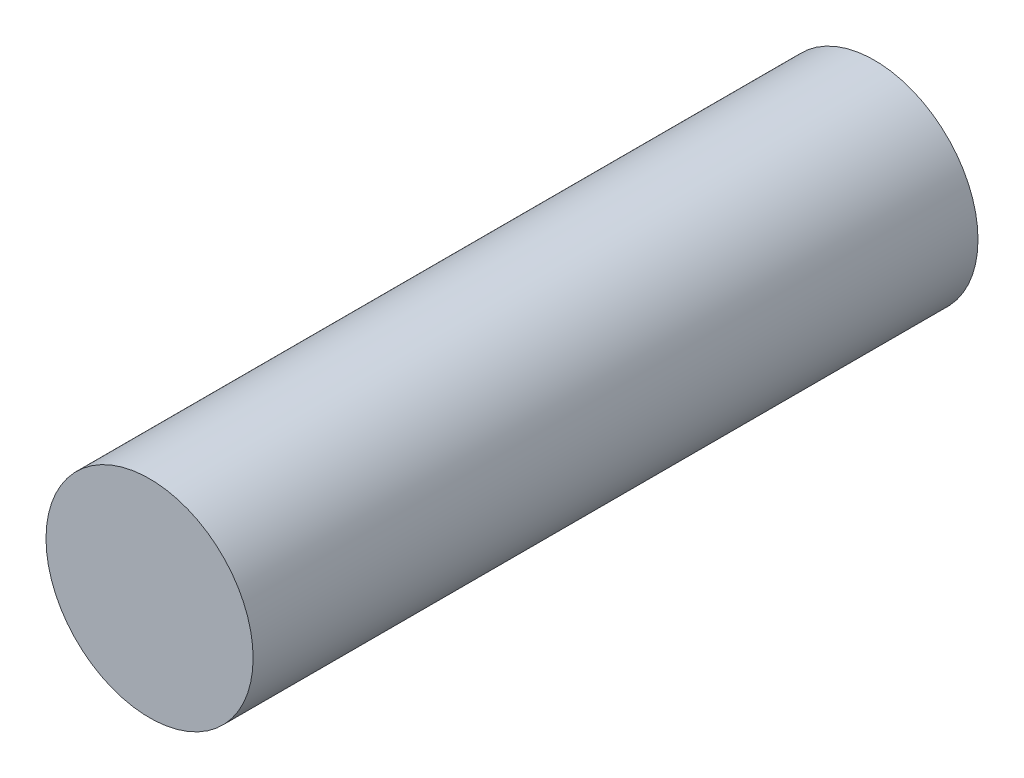
ISO-10303-21;
HEADER;
FILE_DESCRIPTION(('STEP AP214'),'2;1');
FILE_NAME('part.step','',(''),(''),'','','');
FILE_SCHEMA(('AUTOMOTIVE_DESIGN { 1 0 10303 214 1 1 1 1 }'));
ENDSEC;
DATA;
#1=APPLICATION_CONTEXT('core data for automotive mechanical design processes');
#2=APPLICATION_PROTOCOL_DEFINITION('international standard','automotive_design',2000,#1);
#3=PRODUCT_CONTEXT('',#1,'mechanical');
#4=PRODUCT('Part','Part','',(#3));
#5=PRODUCT_RELATED_PRODUCT_CATEGORY('part','',(#4));
#6=PRODUCT_DEFINITION_FORMATION('','',#4);
#7=PRODUCT_DEFINITION_CONTEXT('part definition',#1,'design');
#8=PRODUCT_DEFINITION('design','',#6,#7);
#9=PRODUCT_DEFINITION_SHAPE('','',#8);
#10=(LENGTH_UNIT() NAMED_UNIT(*) SI_UNIT(.MILLI.,.METRE.));
#11=(NAMED_UNIT(*) PLANE_ANGLE_UNIT() SI_UNIT($,.RADIAN.));
#12=(NAMED_UNIT(*) SI_UNIT($,.STERADIAN.) SOLID_ANGLE_UNIT());
#13=UNCERTAINTY_MEASURE_WITH_UNIT(LENGTH_MEASURE(1.E-05),#10,'distance_accuracy_value','');
#14=(GEOMETRIC_REPRESENTATION_CONTEXT(3) GLOBAL_UNCERTAINTY_ASSIGNED_CONTEXT((#13)) GLOBAL_UNIT_ASSIGNED_CONTEXT((#10,
#11,#12)) REPRESENTATION_CONTEXT('',''));
#15=CARTESIAN_POINT('',(0.,0.,0.));
#16=DIRECTION('',(0.,0.,1.));
#17=DIRECTION('',(1.,0.,0.));
#18=AXIS2_PLACEMENT_3D('',#15,#16,#17);
#19=CARTESIAN_POINT('',(0.,0.,88.9));
#20=DIRECTION('',(0.,0.,-1.));
#21=DIRECTION('',(-1.,0.,0.));
#22=AXIS2_PLACEMENT_3D('',#19,#20,#21);
#23=CYLINDRICAL_SURFACE('',#22,12.7);
#24=CARTESIAN_POINT('',(0.,0.,88.9));
#25=DIRECTION('',(0.,0.,1.));
#26=DIRECTION('',(1.,0.,0.));
#27=AXIS2_PLACEMENT_3D('',#24,#25,#26);
#28=CIRCLE('',#27,12.7);
#29=CARTESIAN_POINT('',(12.7,0.,88.9));
#30=VERTEX_POINT('',#29);
#31=EDGE_CURVE('E10',#30,#30,#28,.T.);
#32=ORIENTED_EDGE('',*,*,#31,.F.);
#33=EDGE_LOOP('',(#32));
#34=FACE_BOUND('',#33,.T.);
#35=CARTESIAN_POINT('',(0.,0.,0.));
#36=DIRECTION('',(0.,0.,1.));
#37=DIRECTION('',(1.,0.,0.));
#38=AXIS2_PLACEMENT_3D('',#35,#36,#37);
#39=CIRCLE('',#38,12.7);
#40=CARTESIAN_POINT('',(12.7,0.,0.));
#41=VERTEX_POINT('',#40);
#42=EDGE_CURVE('E40',#41,#41,#39,.T.);
#43=ORIENTED_EDGE('',*,*,#42,.T.);
#44=EDGE_LOOP('',(#43));
#45=FACE_BOUND('',#44,.T.);
#46=ADVANCED_FACE('F37',(#34,#45),#23,.T.);
#47=CARTESIAN_POINT('',(0.,0.,88.9));
#48=DIRECTION('',(0.,0.,1.));
#49=DIRECTION('',(1.,0.,0.));
#50=AXIS2_PLACEMENT_3D('',#47,#48,#49);
#51=PLANE('',#50);
#52=ORIENTED_EDGE('',*,*,#31,.T.);
#53=EDGE_LOOP('',(#52));
#54=FACE_BOUND('',#53,.T.);
#55=ADVANCED_FACE('F54',(#54),#51,.T.);
#56=CARTESIAN_POINT('',(0.,0.,0.));
#57=DIRECTION('',(0.,0.,1.));
#58=DIRECTION('',(1.,0.,0.));
#59=AXIS2_PLACEMENT_3D('',#56,#57,#58);
#60=PLANE('',#59);
#61=ORIENTED_EDGE('',*,*,#42,.F.);
#62=EDGE_LOOP('',(#61));
#63=FACE_BOUND('',#62,.T.);
#64=ADVANCED_FACE('F52',(#63),#60,.F.);
#65=CLOSED_SHELL('',(#46,#55,#64));
#66=MANIFOLD_SOLID_BREP('B2',#65);
#67=ADVANCED_BREP_SHAPE_REPRESENTATION('',(#18,#66),#14);
#68=SHAPE_DEFINITION_REPRESENTATION(#9,#67);
ENDSEC;
END-ISO-10303-21;
